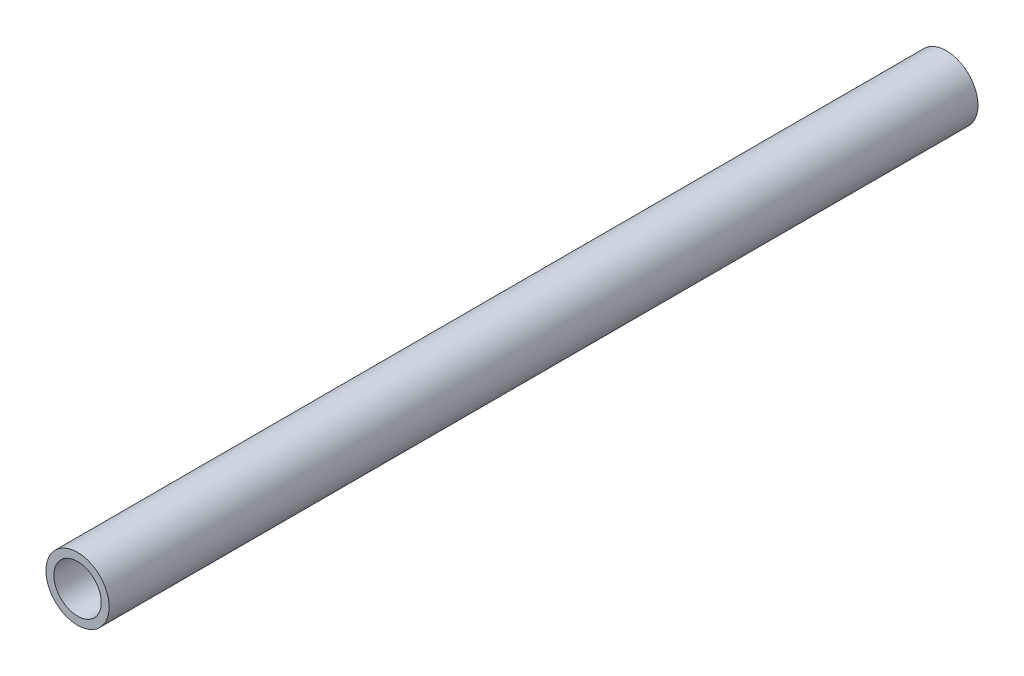
ISO-10303-21;
HEADER;
FILE_DESCRIPTION(('STEP AP214'),'2;1');
FILE_NAME('part.step','',(''),(''),'','','');
FILE_SCHEMA(('AUTOMOTIVE_DESIGN { 1 0 10303 214 1 1 1 1 }'));
ENDSEC;
DATA;
#1=APPLICATION_CONTEXT('core data for automotive mechanical design processes');
#2=APPLICATION_PROTOCOL_DEFINITION('international standard','automotive_design',2000,#1);
#3=PRODUCT_CONTEXT('',#1,'mechanical');
#4=PRODUCT('Part','Part','',(#3));
#5=PRODUCT_RELATED_PRODUCT_CATEGORY('part','',(#4));
#6=PRODUCT_DEFINITION_FORMATION('','',#4);
#7=PRODUCT_DEFINITION_CONTEXT('part definition',#1,'design');
#8=PRODUCT_DEFINITION('design','',#6,#7);
#9=PRODUCT_DEFINITION_SHAPE('','',#8);
#10=(LENGTH_UNIT() NAMED_UNIT(*) SI_UNIT(.MILLI.,.METRE.));
#11=(NAMED_UNIT(*) PLANE_ANGLE_UNIT() SI_UNIT($,.RADIAN.));
#12=(NAMED_UNIT(*) SI_UNIT($,.STERADIAN.) SOLID_ANGLE_UNIT());
#13=UNCERTAINTY_MEASURE_WITH_UNIT(LENGTH_MEASURE(1.E-05),#10,'distance_accuracy_value','');
#14=(GEOMETRIC_REPRESENTATION_CONTEXT(3) GLOBAL_UNCERTAINTY_ASSIGNED_CONTEXT((#13)) GLOBAL_UNIT_ASSIGNED_CONTEXT((#10,
#11,#12)) REPRESENTATION_CONTEXT('',''));
#15=CARTESIAN_POINT('',(0.,0.,0.));
#16=DIRECTION('',(0.,0.,1.));
#17=DIRECTION('',(1.,0.,0.));
#18=AXIS2_PLACEMENT_3D('',#15,#16,#17);
#19=CARTESIAN_POINT('',(0.,0.,110.));
#20=DIRECTION('',(0.,0.,1.));
#21=DIRECTION('',(1.,0.,0.));
#22=AXIS2_PLACEMENT_3D('',#19,#20,#21);
#23=PLANE('',#22);
#24=CARTESIAN_POINT('',(0.,0.,110.));
#25=DIRECTION('',(0.,0.,1.));
#26=DIRECTION('',(1.,0.,0.));
#27=AXIS2_PLACEMENT_3D('',#24,#25,#26);
#28=CIRCLE('',#27,4.);
#29=CARTESIAN_POINT('',(4.,0.,110.));
#30=VERTEX_POINT('',#29);
#31=EDGE_CURVE('E10',#30,#30,#28,.T.);
#32=ORIENTED_EDGE('',*,*,#31,.T.);
#33=EDGE_LOOP('',(#32));
#34=FACE_BOUND('',#33,.T.);
#35=CARTESIAN_POINT('',(0.,0.,110.));
#36=DIRECTION('',(0.,0.,1.));
#37=DIRECTION('',(1.,0.,0.));
#38=AXIS2_PLACEMENT_3D('',#35,#36,#37);
#39=CIRCLE('',#38,3.);
#40=CARTESIAN_POINT('',(3.,0.,110.));
#41=VERTEX_POINT('',#40);
#42=EDGE_CURVE('E49',#41,#41,#39,.T.);
#43=ORIENTED_EDGE('',*,*,#42,.F.);
#44=EDGE_LOOP('',(#43));
#45=FACE_BOUND('',#44,.T.);
#46=ADVANCED_FACE('F38',(#34,#45),#23,.T.);
#47=CARTESIAN_POINT('',(0.,0.,0.));
#48=DIRECTION('',(0.,0.,1.));
#49=DIRECTION('',(1.,0.,0.));
#50=AXIS2_PLACEMENT_3D('',#47,#48,#49);
#51=PLANE('',#50);
#52=CARTESIAN_POINT('',(0.,0.,0.));
#53=DIRECTION('',(0.,0.,1.));
#54=DIRECTION('',(1.,0.,0.));
#55=AXIS2_PLACEMENT_3D('',#52,#53,#54);
#56=CIRCLE('',#55,4.);
#57=CARTESIAN_POINT('',(4.,0.,0.));
#58=VERTEX_POINT('',#57);
#59=EDGE_CURVE('E42',#58,#58,#56,.T.);
#60=ORIENTED_EDGE('',*,*,#59,.F.);
#61=EDGE_LOOP('',(#60));
#62=FACE_BOUND('',#61,.T.);
#63=CARTESIAN_POINT('',(0.,0.,0.));
#64=DIRECTION('',(0.,0.,1.));
#65=DIRECTION('',(1.,0.,0.));
#66=AXIS2_PLACEMENT_3D('',#63,#64,#65);
#67=CIRCLE('',#66,3.);
#68=CARTESIAN_POINT('',(3.,0.,0.));
#69=VERTEX_POINT('',#68);
#70=EDGE_CURVE('E51',#69,#69,#67,.T.);
#71=ORIENTED_EDGE('',*,*,#70,.T.);
#72=EDGE_LOOP('',(#71));
#73=FACE_BOUND('',#72,.T.);
#74=ADVANCED_FACE('F61',(#62,#73),#51,.F.);
#75=CARTESIAN_POINT('',(0.,0.,110.));
#76=DIRECTION('',(0.,0.,-1.));
#77=DIRECTION('',(-1.,0.,0.));
#78=AXIS2_PLACEMENT_3D('',#75,#76,#77);
#79=CYLINDRICAL_SURFACE('',#78,4.);
#80=ORIENTED_EDGE('',*,*,#31,.F.);
#81=EDGE_LOOP('',(#80));
#82=FACE_BOUND('',#81,.T.);
#83=ORIENTED_EDGE('',*,*,#59,.T.);
#84=EDGE_LOOP('',(#83));
#85=FACE_BOUND('',#84,.T.);
#86=ADVANCED_FACE('F40',(#82,#85),#79,.T.);
#87=CARTESIAN_POINT('',(0.,0.,110.));
#88=DIRECTION('',(0.,0.,-1.));
#89=DIRECTION('',(-1.,0.,0.));
#90=AXIS2_PLACEMENT_3D('',#87,#88,#89);
#91=CYLINDRICAL_SURFACE('',#90,3.);
#92=ORIENTED_EDGE('',*,*,#42,.T.);
#93=EDGE_LOOP('',(#92));
#94=FACE_BOUND('',#93,.T.);
#95=ORIENTED_EDGE('',*,*,#70,.F.);
#96=EDGE_LOOP('',(#95));
#97=FACE_BOUND('',#96,.T.);
#98=ADVANCED_FACE('F57',(#94,#97),#91,.F.);
#99=CLOSED_SHELL('',(#46,#74,#86,#98));
#100=MANIFOLD_SOLID_BREP('B2',#99);
#101=ADVANCED_BREP_SHAPE_REPRESENTATION('',(#18,#100),#14);
#102=SHAPE_DEFINITION_REPRESENTATION(#9,#101);
ENDSEC;
END-ISO-10303-21;
